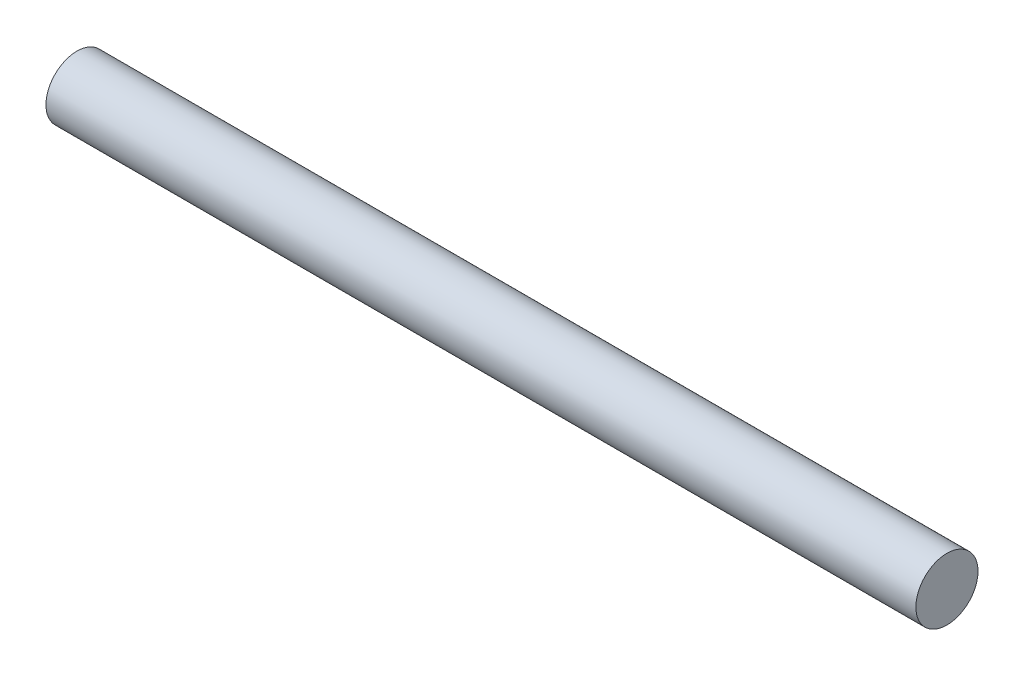
ISO-10303-21;
HEADER;
FILE_DESCRIPTION(('STEP AP214'),'2;1');
FILE_NAME('part.step','',(''),(''),'','','');
FILE_SCHEMA(('AUTOMOTIVE_DESIGN { 1 0 10303 214 1 1 1 1 }'));
ENDSEC;
DATA;
#1=APPLICATION_CONTEXT('core data for automotive mechanical design processes');
#2=APPLICATION_PROTOCOL_DEFINITION('international standard','automotive_design',2000,#1);
#3=PRODUCT_CONTEXT('',#1,'mechanical');
#4=PRODUCT('Part','Part','',(#3));
#5=PRODUCT_RELATED_PRODUCT_CATEGORY('part','',(#4));
#6=PRODUCT_DEFINITION_FORMATION('','',#4);
#7=PRODUCT_DEFINITION_CONTEXT('part definition',#1,'design');
#8=PRODUCT_DEFINITION('design','',#6,#7);
#9=PRODUCT_DEFINITION_SHAPE('','',#8);
#10=(LENGTH_UNIT() NAMED_UNIT(*) SI_UNIT(.MILLI.,.METRE.));
#11=(NAMED_UNIT(*) PLANE_ANGLE_UNIT() SI_UNIT($,.RADIAN.));
#12=(NAMED_UNIT(*) SI_UNIT($,.STERADIAN.) SOLID_ANGLE_UNIT());
#13=UNCERTAINTY_MEASURE_WITH_UNIT(LENGTH_MEASURE(1.E-05),#10,'distance_accuracy_value','');
#14=(GEOMETRIC_REPRESENTATION_CONTEXT(3) GLOBAL_UNCERTAINTY_ASSIGNED_CONTEXT((#13)) GLOBAL_UNIT_ASSIGNED_CONTEXT((#10,
#11,#12)) REPRESENTATION_CONTEXT('',''));
#15=CARTESIAN_POINT('',(0.,0.,0.));
#16=DIRECTION('',(0.,0.,1.));
#17=DIRECTION('',(1.,0.,0.));
#18=AXIS2_PLACEMENT_3D('',#15,#16,#17);
#19=CARTESIAN_POINT('',(70.,0.,0.));
#20=DIRECTION('',(-1.,0.,0.));
#21=DIRECTION('',(0.,0.,1.));
#22=AXIS2_PLACEMENT_3D('',#19,#20,#21);
#23=CYLINDRICAL_SURFACE('',#22,2.5);
#24=CARTESIAN_POINT('',(70.,0.,0.));
#25=DIRECTION('',(1.,0.,0.));
#26=DIRECTION('',(0.,0.,-1.));
#27=AXIS2_PLACEMENT_3D('',#24,#25,#26);
#28=CIRCLE('',#27,2.5);
#29=CARTESIAN_POINT('',(70.,0.,-2.5));
#30=VERTEX_POINT('',#29);
#31=EDGE_CURVE('E10',#30,#30,#28,.T.);
#32=ORIENTED_EDGE('',*,*,#31,.F.);
#33=EDGE_LOOP('',(#32));
#34=FACE_BOUND('',#33,.T.);
#35=CARTESIAN_POINT('',(0.,0.,0.));
#36=DIRECTION('',(1.,0.,0.));
#37=DIRECTION('',(0.,0.,-1.));
#38=AXIS2_PLACEMENT_3D('',#35,#36,#37);
#39=CIRCLE('',#38,2.5);
#40=CARTESIAN_POINT('',(0.,0.,-2.5));
#41=VERTEX_POINT('',#40);
#42=EDGE_CURVE('E34',#41,#41,#39,.T.);
#43=ORIENTED_EDGE('',*,*,#42,.T.);
#44=EDGE_LOOP('',(#43));
#45=FACE_BOUND('',#44,.T.);
#46=ADVANCED_FACE('F31',(#34,#45),#23,.T.);
#47=CARTESIAN_POINT('',(70.,0.,0.));
#48=DIRECTION('',(1.,0.,0.));
#49=DIRECTION('',(0.,0.,-1.));
#50=AXIS2_PLACEMENT_3D('',#47,#48,#49);
#51=PLANE('',#50);
#52=ORIENTED_EDGE('',*,*,#31,.T.);
#53=EDGE_LOOP('',(#52));
#54=FACE_BOUND('',#53,.T.);
#55=ADVANCED_FACE('F46',(#54),#51,.T.);
#56=CARTESIAN_POINT('',(0.,0.,0.));
#57=DIRECTION('',(1.,0.,0.));
#58=DIRECTION('',(0.,0.,-1.));
#59=AXIS2_PLACEMENT_3D('',#56,#57,#58);
#60=PLANE('',#59);
#61=ORIENTED_EDGE('',*,*,#42,.F.);
#62=EDGE_LOOP('',(#61));
#63=FACE_BOUND('',#62,.T.);
#64=ADVANCED_FACE('F44',(#63),#60,.F.);
#65=CLOSED_SHELL('',(#46,#55,#64));
#66=MANIFOLD_SOLID_BREP('B2',#65);
#67=ADVANCED_BREP_SHAPE_REPRESENTATION('',(#18,#66),#14);
#68=SHAPE_DEFINITION_REPRESENTATION(#9,#67);
ENDSEC;
END-ISO-10303-21;
